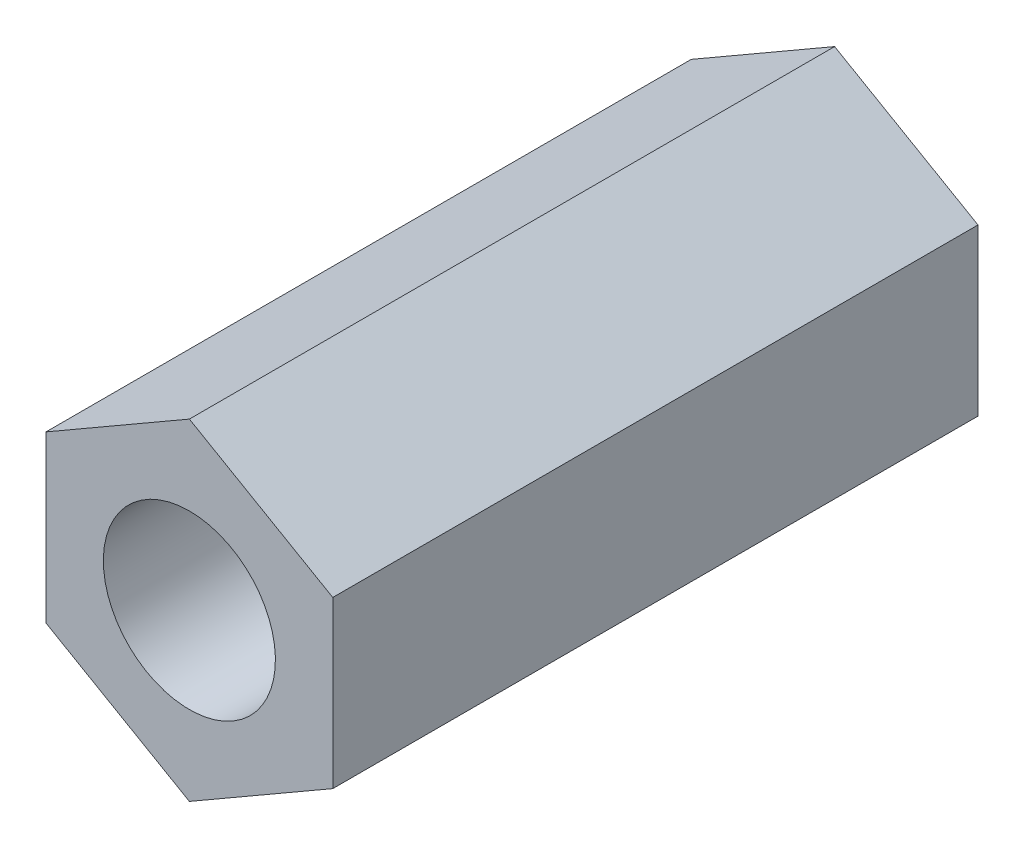
ISO-10303-21;
HEADER;
FILE_DESCRIPTION(('STEP AP214'),'2;1');
FILE_NAME('part.step','',(''),(''),'','','');
FILE_SCHEMA(('AUTOMOTIVE_DESIGN { 1 0 10303 214 1 1 1 1 }'));
ENDSEC;
DATA;
#1=APPLICATION_CONTEXT('core data for automotive mechanical design processes');
#2=APPLICATION_PROTOCOL_DEFINITION('international standard','automotive_design',2000,#1);
#3=PRODUCT_CONTEXT('',#1,'mechanical');
#4=PRODUCT('Part','Part','',(#3));
#5=PRODUCT_RELATED_PRODUCT_CATEGORY('part','',(#4));
#6=PRODUCT_DEFINITION_FORMATION('','',#4);
#7=PRODUCT_DEFINITION_CONTEXT('part definition',#1,'design');
#8=PRODUCT_DEFINITION('design','',#6,#7);
#9=PRODUCT_DEFINITION_SHAPE('','',#8);
#10=(LENGTH_UNIT() NAMED_UNIT(*) SI_UNIT(.MILLI.,.METRE.));
#11=(NAMED_UNIT(*) PLANE_ANGLE_UNIT() SI_UNIT($,.RADIAN.));
#12=(NAMED_UNIT(*) SI_UNIT($,.STERADIAN.) SOLID_ANGLE_UNIT());
#13=UNCERTAINTY_MEASURE_WITH_UNIT(LENGTH_MEASURE(1.E-05),#10,'distance_accuracy_value','');
#14=(GEOMETRIC_REPRESENTATION_CONTEXT(3) GLOBAL_UNCERTAINTY_ASSIGNED_CONTEXT((#13)) GLOBAL_UNIT_ASSIGNED_CONTEXT((#10,
#11,#12)) REPRESENTATION_CONTEXT('',''));
#15=CARTESIAN_POINT('',(0.,0.,0.));
#16=DIRECTION('',(0.,0.,1.));
#17=DIRECTION('',(1.,0.,0.));
#18=AXIS2_PLACEMENT_3D('',#15,#16,#17);
#19=CARTESIAN_POINT('',(0.,0.,11.25));
#20=DIRECTION('',(0.,0.,-1.));
#21=DIRECTION('',(0.,1.,0.));
#22=AXIS2_PLACEMENT_3D('',#19,#20,#21);
#23=CYLINDRICAL_SURFACE('',#22,1.5);
#24=CARTESIAN_POINT('',(0.,0.,11.25));
#25=DIRECTION('',(0.,0.,1.));
#26=DIRECTION('',(0.,1.,0.));
#27=AXIS2_PLACEMENT_3D('',#24,#25,#26);
#28=CIRCLE('',#27,1.5);
#29=CARTESIAN_POINT('',(0.,1.5,11.25));
#30=VERTEX_POINT('',#29);
#31=EDGE_CURVE('E108',#30,#30,#28,.T.);
#32=ORIENTED_EDGE('',*,*,#31,.T.);
#33=DIRECTION('',(0.,0.,-1.));
#34=VECTOR('',#33,1.);
#35=CARTESIAN_POINT('',(0.,1.5,11.25));
#36=LINE('',#35,#34);
#37=CARTESIAN_POINT('',(0.,1.5,0.));
#38=VERTEX_POINT('',#37);
#39=EDGE_CURVE('E10',#30,#38,#36,.T.);
#40=ORIENTED_EDGE('',*,*,#39,.T.);
#41=CARTESIAN_POINT('',(0.,0.,0.));
#42=DIRECTION('',(0.,0.,-1.));
#43=DIRECTION('',(0.,1.,0.));
#44=AXIS2_PLACEMENT_3D('',#41,#42,#43);
#45=CIRCLE('',#44,1.5);
#46=EDGE_CURVE('E113',#38,#38,#45,.T.);
#47=ORIENTED_EDGE('',*,*,#46,.T.);
#48=ORIENTED_EDGE('',*,*,#39,.F.);
#49=EDGE_LOOP('',(#32,#40,#47,#48));
#50=FACE_BOUND('',#49,.T.);
#51=ADVANCED_FACE('F16',(#50),#23,.F.);
#52=CARTESIAN_POINT('',(-2.5,0.,5.625));
#53=DIRECTION('',(-1.,0.,0.));
#54=DIRECTION('',(0.,1.,0.));
#55=AXIS2_PLACEMENT_3D('',#52,#53,#54);
#56=PLANE('',#55);
#57=DIRECTION('',(0.,-1.,0.));
#58=VECTOR('',#57,1.);
#59=CARTESIAN_POINT('',(-2.5,1.4433756729738,0.));
#60=LINE('',#59,#58);
#61=CARTESIAN_POINT('',(-2.5,1.4433756729738,0.));
#62=VERTEX_POINT('',#61);
#63=CARTESIAN_POINT('',(-2.5,-1.4433756729738,0.));
#64=VERTEX_POINT('',#63);
#65=EDGE_CURVE('E95',#62,#64,#60,.T.);
#66=ORIENTED_EDGE('',*,*,#65,.T.);
#67=DIRECTION('',(0.,0.,1.));
#68=VECTOR('',#67,1.);
#69=CARTESIAN_POINT('',(-2.5,-1.4433756729738,0.));
#70=LINE('',#69,#68);
#71=CARTESIAN_POINT('',(-2.5,-1.4433756729738,11.25));
#72=VERTEX_POINT('',#71);
#73=EDGE_CURVE('E84',#64,#72,#70,.T.);
#74=ORIENTED_EDGE('',*,*,#73,.T.);
#75=DIRECTION('',(0.,-1.,0.));
#76=VECTOR('',#75,1.);
#77=CARTESIAN_POINT('',(-2.5,1.4433756729738,11.25));
#78=LINE('',#77,#76);
#79=CARTESIAN_POINT('',(-2.5,1.4433756729738,11.25));
#80=VERTEX_POINT('',#79);
#81=EDGE_CURVE('E86',#80,#72,#78,.T.);
#82=ORIENTED_EDGE('',*,*,#81,.F.);
#83=DIRECTION('',(0.,0.,1.));
#84=VECTOR('',#83,1.);
#85=CARTESIAN_POINT('',(-2.5,1.4433756729738,0.));
#86=LINE('',#85,#84);
#87=EDGE_CURVE('E24',#62,#80,#86,.T.);
#88=ORIENTED_EDGE('',*,*,#87,.F.);
#89=EDGE_LOOP('',(#66,#74,#82,#88));
#90=FACE_BOUND('',#89,.T.);
#91=ADVANCED_FACE('F87',(#90),#56,.T.);
#92=CARTESIAN_POINT('',(-1.25,2.1650635094611,5.625));
#93=DIRECTION('',(-0.500000000000151,0.866025403784352,0.));
#94=DIRECTION('',(0.,0.,1.));
#95=AXIS2_PLACEMENT_3D('',#92,#93,#94);
#96=PLANE('',#95);
#97=DIRECTION('',(-0.866025403784351,-0.500000000000151,0.));
#98=VECTOR('',#97,1.);
#99=CARTESIAN_POINT('',(0.,2.8867513459484,0.));
#100=LINE('',#99,#98);
#101=CARTESIAN_POINT('',(0.,2.8867513459484,0.));
#102=VERTEX_POINT('',#101);
#103=EDGE_CURVE('E170',#102,#62,#100,.T.);
#104=ORIENTED_EDGE('',*,*,#103,.T.);
#105=ORIENTED_EDGE('',*,*,#87,.T.);
#106=DIRECTION('',(-0.866025403784351,-0.500000000000151,0.));
#107=VECTOR('',#106,1.);
#108=CARTESIAN_POINT('',(0.,2.8867513459484,11.25));
#109=LINE('',#108,#107);
#110=CARTESIAN_POINT('',(0.,2.8867513459484,11.25));
#111=VERTEX_POINT('',#110);
#112=EDGE_CURVE('E110',#111,#80,#109,.T.);
#113=ORIENTED_EDGE('',*,*,#112,.F.);
#114=DIRECTION('',(0.,0.,1.));
#115=VECTOR('',#114,1.);
#116=CARTESIAN_POINT('',(0.,2.8867513459484,0.));
#117=LINE('',#116,#115);
#118=EDGE_CURVE('E143',#102,#111,#117,.T.);
#119=ORIENTED_EDGE('',*,*,#118,.F.);
#120=EDGE_LOOP('',(#104,#105,#113,#119));
#121=FACE_BOUND('',#120,.T.);
#122=ADVANCED_FACE('F153',(#121),#96,.T.);
#123=CARTESIAN_POINT('',(1.25,2.1650635094611,5.625));
#124=DIRECTION('',(0.500000000000151,0.866025403784352,0.));
#125=DIRECTION('',(0.,0.,-1.));
#126=AXIS2_PLACEMENT_3D('',#123,#124,#125);
#127=PLANE('',#126);
#128=DIRECTION('',(-0.866025403784351,0.500000000000151,0.));
#129=VECTOR('',#128,1.);
#130=CARTESIAN_POINT('',(2.5,1.4433756729738,0.));
#131=LINE('',#130,#129);
#132=CARTESIAN_POINT('',(2.5,1.4433756729738,0.));
#133=VERTEX_POINT('',#132);
#134=EDGE_CURVE('E151',#133,#102,#131,.T.);
#135=ORIENTED_EDGE('',*,*,#134,.T.);
#136=ORIENTED_EDGE('',*,*,#118,.T.);
#137=DIRECTION('',(-0.866025403784351,0.500000000000151,0.));
#138=VECTOR('',#137,1.);
#139=CARTESIAN_POINT('',(2.5,1.4433756729738,11.25));
#140=LINE('',#139,#138);
#141=CARTESIAN_POINT('',(2.5,1.4433756729738,11.25));
#142=VERTEX_POINT('',#141);
#143=EDGE_CURVE('E128',#142,#111,#140,.T.);
#144=ORIENTED_EDGE('',*,*,#143,.F.);
#145=DIRECTION('',(0.,0.,1.));
#146=VECTOR('',#145,1.);
#147=CARTESIAN_POINT('',(2.5,1.4433756729738,0.));
#148=LINE('',#147,#146);
#149=EDGE_CURVE('E138',#133,#142,#148,.T.);
#150=ORIENTED_EDGE('',*,*,#149,.F.);
#151=EDGE_LOOP('',(#135,#136,#144,#150));
#152=FACE_BOUND('',#151,.T.);
#153=ADVANCED_FACE('F149',(#152),#127,.T.);
#154=CARTESIAN_POINT('',(2.5,0.,5.625));
#155=DIRECTION('',(1.,0.,0.));
#156=DIRECTION('',(0.,1.,0.));
#157=AXIS2_PLACEMENT_3D('',#154,#155,#156);
#158=PLANE('',#157);
#159=DIRECTION('',(0.,1.,0.));
#160=VECTOR('',#159,1.);
#161=CARTESIAN_POINT('',(2.5,-1.4433756729738,0.));
#162=LINE('',#161,#160);
#163=CARTESIAN_POINT('',(2.5,-1.4433756729738,0.));
#164=VERTEX_POINT('',#163);
#165=EDGE_CURVE('E159',#164,#133,#162,.T.);
#166=ORIENTED_EDGE('',*,*,#165,.T.);
#167=ORIENTED_EDGE('',*,*,#149,.T.);
#168=DIRECTION('',(0.,1.,0.));
#169=VECTOR('',#168,1.);
#170=CARTESIAN_POINT('',(2.5,-1.4433756729738,11.25));
#171=LINE('',#170,#169);
#172=CARTESIAN_POINT('',(2.5,-1.4433756729738,11.25));
#173=VERTEX_POINT('',#172);
#174=EDGE_CURVE('E120',#173,#142,#171,.T.);
#175=ORIENTED_EDGE('',*,*,#174,.F.);
#176=DIRECTION('',(0.,0.,1.));
#177=VECTOR('',#176,1.);
#178=CARTESIAN_POINT('',(2.5,-1.4433756729738,0.));
#179=LINE('',#178,#177);
#180=EDGE_CURVE('E98',#164,#173,#179,.T.);
#181=ORIENTED_EDGE('',*,*,#180,.F.);
#182=EDGE_LOOP('',(#166,#167,#175,#181));
#183=FACE_BOUND('',#182,.T.);
#184=ADVANCED_FACE('F160',(#183),#158,.T.);
#185=CARTESIAN_POINT('',(1.25,-2.1650635094611,5.625));
#186=DIRECTION('',(0.500000000000151,-0.866025403784352,0.));
#187=DIRECTION('',(0.,0.,-1.));
#188=AXIS2_PLACEMENT_3D('',#185,#186,#187);
#189=PLANE('',#188);
#190=DIRECTION('',(0.866025403784351,0.500000000000151,0.));
#191=VECTOR('',#190,1.);
#192=CARTESIAN_POINT('',(0.,-2.8867513459484,0.));
#193=LINE('',#192,#191);
#194=CARTESIAN_POINT('',(0.,-2.8867513459484,0.));
#195=VERTEX_POINT('',#194);
#196=EDGE_CURVE('E163',#195,#164,#193,.T.);
#197=ORIENTED_EDGE('',*,*,#196,.T.);
#198=ORIENTED_EDGE('',*,*,#180,.T.);
#199=DIRECTION('',(0.866025403784351,0.500000000000151,0.));
#200=VECTOR('',#199,1.);
#201=CARTESIAN_POINT('',(0.,-2.8867513459484,11.25));
#202=LINE('',#201,#200);
#203=CARTESIAN_POINT('',(0.,-2.8867513459484,11.25));
#204=VERTEX_POINT('',#203);
#205=EDGE_CURVE('E111',#204,#173,#202,.T.);
#206=ORIENTED_EDGE('',*,*,#205,.F.);
#207=DIRECTION('',(0.,0.,1.));
#208=VECTOR('',#207,1.);
#209=CARTESIAN_POINT('',(0.,-2.8867513459484,0.));
#210=LINE('',#209,#208);
#211=EDGE_CURVE('E97',#195,#204,#210,.T.);
#212=ORIENTED_EDGE('',*,*,#211,.F.);
#213=EDGE_LOOP('',(#197,#198,#206,#212));
#214=FACE_BOUND('',#213,.T.);
#215=ADVANCED_FACE('F178',(#214),#189,.T.);
#216=CARTESIAN_POINT('',(-1.25,-2.1650635094611,5.625));
#217=DIRECTION('',(-0.500000000000158,-0.866025403784347,0.));
#218=DIRECTION('',(-0.866025403784347,0.500000000000158,0.));
#219=AXIS2_PLACEMENT_3D('',#216,#217,#218);
#220=PLANE('',#219);
#221=DIRECTION('',(0.866025403784347,-0.500000000000158,0.));
#222=VECTOR('',#221,1.);
#223=CARTESIAN_POINT('',(-2.5,-1.4433756729738,0.));
#224=LINE('',#223,#222);
#225=EDGE_CURVE('E124',#64,#195,#224,.T.);
#226=ORIENTED_EDGE('',*,*,#225,.T.);
#227=ORIENTED_EDGE('',*,*,#211,.T.);
#228=DIRECTION('',(0.866025403784347,-0.500000000000158,0.));
#229=VECTOR('',#228,1.);
#230=CARTESIAN_POINT('',(-2.5,-1.4433756729738,11.25));
#231=LINE('',#230,#229);
#232=EDGE_CURVE('E104',#72,#204,#231,.T.);
#233=ORIENTED_EDGE('',*,*,#232,.F.);
#234=ORIENTED_EDGE('',*,*,#73,.F.);
#235=EDGE_LOOP('',(#226,#227,#233,#234));
#236=FACE_BOUND('',#235,.T.);
#237=ADVANCED_FACE('F112',(#236),#220,.T.);
#238=CARTESIAN_POINT('',(0.38675134594843,0.,11.25));
#239=DIRECTION('',(0.,0.,1.));
#240=DIRECTION('',(1.,0.,0.));
#241=AXIS2_PLACEMENT_3D('',#238,#239,#240);
#242=PLANE('',#241);
#243=ORIENTED_EDGE('',*,*,#31,.F.);
#244=EDGE_LOOP('',(#243));
#245=FACE_BOUND('',#244,.T.);
#246=ORIENTED_EDGE('',*,*,#232,.T.);
#247=ORIENTED_EDGE('',*,*,#205,.T.);
#248=ORIENTED_EDGE('',*,*,#174,.T.);
#249=ORIENTED_EDGE('',*,*,#143,.T.);
#250=ORIENTED_EDGE('',*,*,#112,.T.);
#251=ORIENTED_EDGE('',*,*,#81,.T.);
#252=EDGE_LOOP('',(#246,#247,#248,#249,#250,#251));
#253=FACE_BOUND('',#252,.T.);
#254=ADVANCED_FACE('F103',(#245,#253),#242,.T.);
#255=CARTESIAN_POINT('',(0.38675134594843,0.,0.));
#256=DIRECTION('',(0.,0.,1.));
#257=DIRECTION('',(1.,0.,0.));
#258=AXIS2_PLACEMENT_3D('',#255,#256,#257);
#259=PLANE('',#258);
#260=ORIENTED_EDGE('',*,*,#46,.F.);
#261=EDGE_LOOP('',(#260));
#262=FACE_BOUND('',#261,.T.);
#263=ORIENTED_EDGE('',*,*,#65,.F.);
#264=ORIENTED_EDGE('',*,*,#103,.F.);
#265=ORIENTED_EDGE('',*,*,#134,.F.);
#266=ORIENTED_EDGE('',*,*,#165,.F.);
#267=ORIENTED_EDGE('',*,*,#196,.F.);
#268=ORIENTED_EDGE('',*,*,#225,.F.);
#269=EDGE_LOOP('',(#263,#264,#265,#266,#267,#268));
#270=FACE_BOUND('',#269,.T.);
#271=ADVANCED_FACE('F167',(#262,#270),#259,.F.);
#272=CLOSED_SHELL('',(#51,#91,#122,#153,#184,#215,#237,#254,#271));
#273=MANIFOLD_SOLID_BREP('B1',#272);
#274=ADVANCED_BREP_SHAPE_REPRESENTATION('',(#18,#273),#14);
#275=SHAPE_DEFINITION_REPRESENTATION(#9,#274);
ENDSEC;
END-ISO-10303-21;
